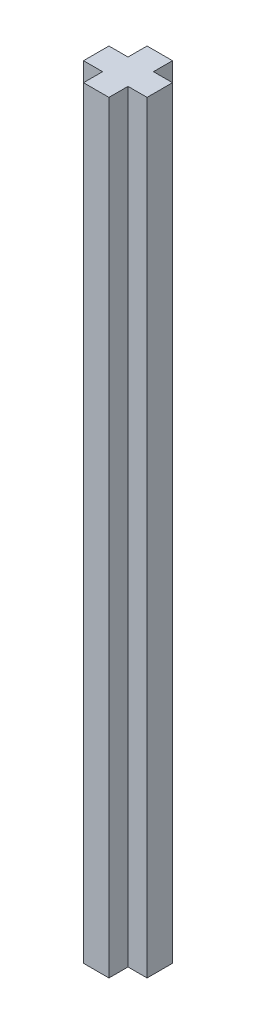
ISO-10303-21;
HEADER;
FILE_DESCRIPTION(('STEP AP214'),'2;1');
FILE_NAME('part.step','',(''),(''),'','','');
FILE_SCHEMA(('AUTOMOTIVE_DESIGN { 1 0 10303 214 1 1 1 1 }'));
ENDSEC;
DATA;
#1=APPLICATION_CONTEXT('core data for automotive mechanical design processes');
#2=APPLICATION_PROTOCOL_DEFINITION('international standard','automotive_design',2000,#1);
#3=PRODUCT_CONTEXT('',#1,'mechanical');
#4=PRODUCT('Part','Part','',(#3));
#5=PRODUCT_RELATED_PRODUCT_CATEGORY('part','',(#4));
#6=PRODUCT_DEFINITION_FORMATION('','',#4);
#7=PRODUCT_DEFINITION_CONTEXT('part definition',#1,'design');
#8=PRODUCT_DEFINITION('design','',#6,#7);
#9=PRODUCT_DEFINITION_SHAPE('','',#8);
#10=(LENGTH_UNIT() NAMED_UNIT(*) SI_UNIT(.MILLI.,.METRE.));
#11=(NAMED_UNIT(*) PLANE_ANGLE_UNIT() SI_UNIT($,.RADIAN.));
#12=(NAMED_UNIT(*) SI_UNIT($,.STERADIAN.) SOLID_ANGLE_UNIT());
#13=UNCERTAINTY_MEASURE_WITH_UNIT(LENGTH_MEASURE(1.E-05),#10,'distance_accuracy_value','');
#14=(GEOMETRIC_REPRESENTATION_CONTEXT(3) GLOBAL_UNCERTAINTY_ASSIGNED_CONTEXT((#13)) GLOBAL_UNIT_ASSIGNED_CONTEXT((#10,
#11,#12)) REPRESENTATION_CONTEXT('',''));
#15=CARTESIAN_POINT('',(0.,0.,0.));
#16=DIRECTION('',(0.,0.,1.));
#17=DIRECTION('',(1.,0.,0.));
#18=AXIS2_PLACEMENT_3D('',#15,#16,#17);
#19=CARTESIAN_POINT('',(1.,60.,0.999999999999999));
#20=DIRECTION('',(-1.,0.,0.));
#21=DIRECTION('',(0.,0.,1.));
#22=AXIS2_PLACEMENT_3D('',#19,#20,#21);
#23=PLANE('',#22);
#24=DIRECTION('',(0.,0.,-1.));
#25=VECTOR('',#24,1.);
#26=CARTESIAN_POINT('',(1.,0.,0.999999999999999));
#27=LINE('',#26,#25);
#28=CARTESIAN_POINT('',(1.,0.,2.5));
#29=VERTEX_POINT('',#28);
#30=CARTESIAN_POINT('',(1.,0.,0.999999999999999));
#31=VERTEX_POINT('',#30);
#32=EDGE_CURVE('E164',#29,#31,#27,.T.);
#33=ORIENTED_EDGE('',*,*,#32,.T.);
#34=DIRECTION('',(0.,-1.,0.));
#35=VECTOR('',#34,1.);
#36=CARTESIAN_POINT('',(1.,60.,0.999999999999999));
#37=LINE('',#36,#35);
#38=CARTESIAN_POINT('',(1.,60.,0.999999999999999));
#39=VERTEX_POINT('',#38);
#40=EDGE_CURVE('E11',#39,#31,#37,.T.);
#41=ORIENTED_EDGE('',*,*,#40,.F.);
#42=DIRECTION('',(0.,0.,-1.));
#43=VECTOR('',#42,1.);
#44=CARTESIAN_POINT('',(1.,60.,0.999999999999999));
#45=LINE('',#44,#43);
#46=CARTESIAN_POINT('',(1.,60.,2.5));
#47=VERTEX_POINT('',#46);
#48=EDGE_CURVE('E198',#47,#39,#45,.T.);
#49=ORIENTED_EDGE('',*,*,#48,.F.);
#50=DIRECTION('',(0.,-1.,0.));
#51=VECTOR('',#50,1.);
#52=CARTESIAN_POINT('',(1.,60.,2.5));
#53=LINE('',#52,#51);
#54=EDGE_CURVE('E160',#47,#29,#53,.T.);
#55=ORIENTED_EDGE('',*,*,#54,.T.);
#56=EDGE_LOOP('',(#33,#41,#49,#55));
#57=FACE_BOUND('',#56,.T.);
#58=ADVANCED_FACE('F39',(#57),#23,.F.);
#59=CARTESIAN_POINT('',(1.,60.,0.999999999999999));
#60=DIRECTION('',(0.,0.,-1.));
#61=DIRECTION('',(-1.,0.,0.));
#62=AXIS2_PLACEMENT_3D('',#59,#60,#61);
#63=PLANE('',#62);
#64=DIRECTION('',(1.,0.,0.));
#65=VECTOR('',#64,1.);
#66=CARTESIAN_POINT('',(1.,0.,0.999999999999999));
#67=LINE('',#66,#65);
#68=CARTESIAN_POINT('',(2.5,0.,0.999999999999999));
#69=VERTEX_POINT('',#68);
#70=EDGE_CURVE('E168',#31,#69,#67,.T.);
#71=ORIENTED_EDGE('',*,*,#70,.T.);
#72=DIRECTION('',(0.,-1.,0.));
#73=VECTOR('',#72,1.);
#74=CARTESIAN_POINT('',(2.5,60.,0.999999999999999));
#75=LINE('',#74,#73);
#76=CARTESIAN_POINT('',(2.5,60.,0.999999999999999));
#77=VERTEX_POINT('',#76);
#78=EDGE_CURVE('E48',#77,#69,#75,.T.);
#79=ORIENTED_EDGE('',*,*,#78,.F.);
#80=DIRECTION('',(1.,0.,0.));
#81=VECTOR('',#80,1.);
#82=CARTESIAN_POINT('',(1.,60.,0.999999999999999));
#83=LINE('',#82,#81);
#84=EDGE_CURVE('E111',#39,#77,#83,.T.);
#85=ORIENTED_EDGE('',*,*,#84,.F.);
#86=ORIENTED_EDGE('',*,*,#40,.T.);
#87=EDGE_LOOP('',(#71,#79,#85,#86));
#88=FACE_BOUND('',#87,.T.);
#89=ADVANCED_FACE('F292',(#88),#63,.F.);
#90=CARTESIAN_POINT('',(2.5,60.,-1.));
#91=DIRECTION('',(-1.,0.,0.));
#92=DIRECTION('',(0.,0.,1.));
#93=AXIS2_PLACEMENT_3D('',#90,#91,#92);
#94=PLANE('',#93);
#95=DIRECTION('',(0.,0.,-1.));
#96=VECTOR('',#95,1.);
#97=CARTESIAN_POINT('',(2.5,0.,-1.));
#98=LINE('',#97,#96);
#99=CARTESIAN_POINT('',(2.5,0.,-1.));
#100=VERTEX_POINT('',#99);
#101=EDGE_CURVE('E171',#69,#100,#98,.T.);
#102=ORIENTED_EDGE('',*,*,#101,.T.);
#103=DIRECTION('',(0.,-1.,0.));
#104=VECTOR('',#103,1.);
#105=CARTESIAN_POINT('',(2.5,60.,-1.));
#106=LINE('',#105,#104);
#107=CARTESIAN_POINT('',(2.5,60.,-1.));
#108=VERTEX_POINT('',#107);
#109=EDGE_CURVE('E225',#108,#100,#106,.T.);
#110=ORIENTED_EDGE('',*,*,#109,.F.);
#111=DIRECTION('',(0.,0.,-1.));
#112=VECTOR('',#111,1.);
#113=CARTESIAN_POINT('',(2.5,60.,-1.));
#114=LINE('',#113,#112);
#115=EDGE_CURVE('E235',#77,#108,#114,.T.);
#116=ORIENTED_EDGE('',*,*,#115,.F.);
#117=ORIENTED_EDGE('',*,*,#78,.T.);
#118=EDGE_LOOP('',(#102,#110,#116,#117));
#119=FACE_BOUND('',#118,.T.);
#120=ADVANCED_FACE('F233',(#119),#94,.F.);
#121=CARTESIAN_POINT('',(1.,60.,-1.));
#122=DIRECTION('',(0.,0.,1.));
#123=DIRECTION('',(1.,0.,0.));
#124=AXIS2_PLACEMENT_3D('',#121,#122,#123);
#125=PLANE('',#124);
#126=DIRECTION('',(-1.,0.,0.));
#127=VECTOR('',#126,1.);
#128=CARTESIAN_POINT('',(1.,0.,-1.));
#129=LINE('',#128,#127);
#130=CARTESIAN_POINT('',(1.,0.,-1.));
#131=VERTEX_POINT('',#130);
#132=EDGE_CURVE('E174',#100,#131,#129,.T.);
#133=ORIENTED_EDGE('',*,*,#132,.T.);
#134=DIRECTION('',(0.,-1.,0.));
#135=VECTOR('',#134,1.);
#136=CARTESIAN_POINT('',(1.,60.,-1.));
#137=LINE('',#136,#135);
#138=CARTESIAN_POINT('',(1.,60.,-1.));
#139=VERTEX_POINT('',#138);
#140=EDGE_CURVE('E221',#139,#131,#137,.T.);
#141=ORIENTED_EDGE('',*,*,#140,.F.);
#142=DIRECTION('',(-1.,0.,0.));
#143=VECTOR('',#142,1.);
#144=CARTESIAN_POINT('',(1.,60.,-1.));
#145=LINE('',#144,#143);
#146=EDGE_CURVE('E254',#108,#139,#145,.T.);
#147=ORIENTED_EDGE('',*,*,#146,.F.);
#148=ORIENTED_EDGE('',*,*,#109,.T.);
#149=EDGE_LOOP('',(#133,#141,#147,#148));
#150=FACE_BOUND('',#149,.T.);
#151=ADVANCED_FACE('F244',(#150),#125,.F.);
#152=CARTESIAN_POINT('',(1.,60.,-2.5));
#153=DIRECTION('',(-1.,0.,0.));
#154=DIRECTION('',(0.,0.,1.));
#155=AXIS2_PLACEMENT_3D('',#152,#153,#154);
#156=PLANE('',#155);
#157=DIRECTION('',(0.,0.,-1.));
#158=VECTOR('',#157,1.);
#159=CARTESIAN_POINT('',(1.,0.,-2.5));
#160=LINE('',#159,#158);
#161=CARTESIAN_POINT('',(1.,0.,-2.5));
#162=VERTEX_POINT('',#161);
#163=EDGE_CURVE('E177',#131,#162,#160,.T.);
#164=ORIENTED_EDGE('',*,*,#163,.T.);
#165=DIRECTION('',(0.,-1.,0.));
#166=VECTOR('',#165,1.);
#167=CARTESIAN_POINT('',(1.,60.,-2.5));
#168=LINE('',#167,#166);
#169=CARTESIAN_POINT('',(1.,60.,-2.5));
#170=VERTEX_POINT('',#169);
#171=EDGE_CURVE('E217',#170,#162,#168,.T.);
#172=ORIENTED_EDGE('',*,*,#171,.F.);
#173=DIRECTION('',(0.,0.,-1.));
#174=VECTOR('',#173,1.);
#175=CARTESIAN_POINT('',(1.,60.,-2.5));
#176=LINE('',#175,#174);
#177=EDGE_CURVE('E250',#139,#170,#176,.T.);
#178=ORIENTED_EDGE('',*,*,#177,.F.);
#179=ORIENTED_EDGE('',*,*,#140,.T.);
#180=EDGE_LOOP('',(#164,#172,#178,#179));
#181=FACE_BOUND('',#180,.T.);
#182=ADVANCED_FACE('F248',(#181),#156,.F.);
#183=CARTESIAN_POINT('',(-1.,60.,-2.5));
#184=DIRECTION('',(0.,0.,1.));
#185=DIRECTION('',(1.,0.,0.));
#186=AXIS2_PLACEMENT_3D('',#183,#184,#185);
#187=PLANE('',#186);
#188=DIRECTION('',(-1.,0.,0.));
#189=VECTOR('',#188,1.);
#190=CARTESIAN_POINT('',(-1.,0.,-2.5));
#191=LINE('',#190,#189);
#192=CARTESIAN_POINT('',(-1.,0.,-2.5));
#193=VERTEX_POINT('',#192);
#194=EDGE_CURVE('E180',#162,#193,#191,.T.);
#195=ORIENTED_EDGE('',*,*,#194,.T.);
#196=DIRECTION('',(0.,-1.,0.));
#197=VECTOR('',#196,1.);
#198=CARTESIAN_POINT('',(-1.,60.,-2.5));
#199=LINE('',#198,#197);
#200=CARTESIAN_POINT('',(-1.,60.,-2.5));
#201=VERTEX_POINT('',#200);
#202=EDGE_CURVE('E213',#201,#193,#199,.T.);
#203=ORIENTED_EDGE('',*,*,#202,.F.);
#204=DIRECTION('',(-1.,0.,0.));
#205=VECTOR('',#204,1.);
#206=CARTESIAN_POINT('',(-1.,60.,-2.5));
#207=LINE('',#206,#205);
#208=EDGE_CURVE('E253',#170,#201,#207,.T.);
#209=ORIENTED_EDGE('',*,*,#208,.F.);
#210=ORIENTED_EDGE('',*,*,#171,.T.);
#211=EDGE_LOOP('',(#195,#203,#209,#210));
#212=FACE_BOUND('',#211,.T.);
#213=ADVANCED_FACE('F305',(#212),#187,.F.);
#214=CARTESIAN_POINT('',(-1.,60.,-2.5));
#215=DIRECTION('',(1.,0.,0.));
#216=DIRECTION('',(0.,0.,-1.));
#217=AXIS2_PLACEMENT_3D('',#214,#215,#216);
#218=PLANE('',#217);
#219=DIRECTION('',(0.,0.,1.));
#220=VECTOR('',#219,1.);
#221=CARTESIAN_POINT('',(-1.,0.,-2.5));
#222=LINE('',#221,#220);
#223=CARTESIAN_POINT('',(-1.,0.,-1.));
#224=VERTEX_POINT('',#223);
#225=EDGE_CURVE('E183',#193,#224,#222,.T.);
#226=ORIENTED_EDGE('',*,*,#225,.T.);
#227=DIRECTION('',(0.,-1.,0.));
#228=VECTOR('',#227,1.);
#229=CARTESIAN_POINT('',(-1.,60.,-1.));
#230=LINE('',#229,#228);
#231=CARTESIAN_POINT('',(-1.,60.,-1.));
#232=VERTEX_POINT('',#231);
#233=EDGE_CURVE('E209',#232,#224,#230,.T.);
#234=ORIENTED_EDGE('',*,*,#233,.F.);
#235=DIRECTION('',(0.,0.,1.));
#236=VECTOR('',#235,1.);
#237=CARTESIAN_POINT('',(-1.,60.,-2.5));
#238=LINE('',#237,#236);
#239=EDGE_CURVE('E258',#201,#232,#238,.T.);
#240=ORIENTED_EDGE('',*,*,#239,.F.);
#241=ORIENTED_EDGE('',*,*,#202,.T.);
#242=EDGE_LOOP('',(#226,#234,#240,#241));
#243=FACE_BOUND('',#242,.T.);
#244=ADVANCED_FACE('F308',(#243),#218,.F.);
#245=CARTESIAN_POINT('',(-2.5,60.,-1.));
#246=DIRECTION('',(0.,0.,1.));
#247=DIRECTION('',(1.,0.,0.));
#248=AXIS2_PLACEMENT_3D('',#245,#246,#247);
#249=PLANE('',#248);
#250=DIRECTION('',(-1.,0.,0.));
#251=VECTOR('',#250,1.);
#252=CARTESIAN_POINT('',(-2.5,0.,-1.));
#253=LINE('',#252,#251);
#254=CARTESIAN_POINT('',(-2.5,0.,-1.));
#255=VERTEX_POINT('',#254);
#256=EDGE_CURVE('E186',#224,#255,#253,.T.);
#257=ORIENTED_EDGE('',*,*,#256,.T.);
#258=DIRECTION('',(0.,-1.,0.));
#259=VECTOR('',#258,1.);
#260=CARTESIAN_POINT('',(-2.5,60.,-1.));
#261=LINE('',#260,#259);
#262=CARTESIAN_POINT('',(-2.5,60.,-1.));
#263=VERTEX_POINT('',#262);
#264=EDGE_CURVE('E205',#263,#255,#261,.T.);
#265=ORIENTED_EDGE('',*,*,#264,.F.);
#266=DIRECTION('',(-1.,0.,0.));
#267=VECTOR('',#266,1.);
#268=CARTESIAN_POINT('',(-2.5,60.,-1.));
#269=LINE('',#268,#267);
#270=EDGE_CURVE('E265',#232,#263,#269,.T.);
#271=ORIENTED_EDGE('',*,*,#270,.F.);
#272=ORIENTED_EDGE('',*,*,#233,.T.);
#273=EDGE_LOOP('',(#257,#265,#271,#272));
#274=FACE_BOUND('',#273,.T.);
#275=ADVANCED_FACE('F273',(#274),#249,.F.);
#276=CARTESIAN_POINT('',(-2.5,60.,-1.));
#277=DIRECTION('',(1.,0.,0.));
#278=DIRECTION('',(0.,0.,-1.));
#279=AXIS2_PLACEMENT_3D('',#276,#277,#278);
#280=PLANE('',#279);
#281=DIRECTION('',(0.,0.,1.));
#282=VECTOR('',#281,1.);
#283=CARTESIAN_POINT('',(-2.5,0.,-1.));
#284=LINE('',#283,#282);
#285=CARTESIAN_POINT('',(-2.5,0.,0.999999999999999));
#286=VERTEX_POINT('',#285);
#287=EDGE_CURVE('E189',#255,#286,#284,.T.);
#288=ORIENTED_EDGE('',*,*,#287,.T.);
#289=DIRECTION('',(0.,-1.,0.));
#290=VECTOR('',#289,1.);
#291=CARTESIAN_POINT('',(-2.5,60.,0.999999999999999));
#292=LINE('',#291,#290);
#293=CARTESIAN_POINT('',(-2.5,60.,0.999999999999999));
#294=VERTEX_POINT('',#293);
#295=EDGE_CURVE('E153',#294,#286,#292,.T.);
#296=ORIENTED_EDGE('',*,*,#295,.F.);
#297=DIRECTION('',(0.,0.,1.));
#298=VECTOR('',#297,1.);
#299=CARTESIAN_POINT('',(-2.5,60.,-1.));
#300=LINE('',#299,#298);
#301=EDGE_CURVE('E142',#263,#294,#300,.T.);
#302=ORIENTED_EDGE('',*,*,#301,.F.);
#303=ORIENTED_EDGE('',*,*,#264,.T.);
#304=EDGE_LOOP('',(#288,#296,#302,#303));
#305=FACE_BOUND('',#304,.T.);
#306=ADVANCED_FACE('F277',(#305),#280,.F.);
#307=CARTESIAN_POINT('',(-2.5,60.,0.999999999999999));
#308=DIRECTION('',(0.,0.,-1.));
#309=DIRECTION('',(-1.,0.,0.));
#310=AXIS2_PLACEMENT_3D('',#307,#308,#309);
#311=PLANE('',#310);
#312=DIRECTION('',(1.,0.,0.));
#313=VECTOR('',#312,1.);
#314=CARTESIAN_POINT('',(-2.5,0.,0.999999999999999));
#315=LINE('',#314,#313);
#316=CARTESIAN_POINT('',(-1.,0.,0.999999999999999));
#317=VERTEX_POINT('',#316);
#318=EDGE_CURVE('E151',#286,#317,#315,.T.);
#319=ORIENTED_EDGE('',*,*,#318,.T.);
#320=DIRECTION('',(0.,-1.,0.));
#321=VECTOR('',#320,1.);
#322=CARTESIAN_POINT('',(-1.,60.,0.999999999999999));
#323=LINE('',#322,#321);
#324=CARTESIAN_POINT('',(-1.,60.,0.999999999999999));
#325=VERTEX_POINT('',#324);
#326=EDGE_CURVE('E148',#325,#317,#323,.T.);
#327=ORIENTED_EDGE('',*,*,#326,.F.);
#328=DIRECTION('',(1.,0.,0.));
#329=VECTOR('',#328,1.);
#330=CARTESIAN_POINT('',(-2.5,60.,0.999999999999999));
#331=LINE('',#330,#329);
#332=EDGE_CURVE('E136',#294,#325,#331,.T.);
#333=ORIENTED_EDGE('',*,*,#332,.F.);
#334=ORIENTED_EDGE('',*,*,#295,.T.);
#335=EDGE_LOOP('',(#319,#327,#333,#334));
#336=FACE_BOUND('',#335,.T.);
#337=ADVANCED_FACE('F149',(#336),#311,.F.);
#338=CARTESIAN_POINT('',(-1.,60.,0.999999999999999));
#339=DIRECTION('',(1.,0.,0.));
#340=DIRECTION('',(0.,0.,-1.));
#341=AXIS2_PLACEMENT_3D('',#338,#339,#340);
#342=PLANE('',#341);
#343=DIRECTION('',(0.,0.,1.));
#344=VECTOR('',#343,1.);
#345=CARTESIAN_POINT('',(-1.,0.,0.999999999999999));
#346=LINE('',#345,#344);
#347=CARTESIAN_POINT('',(-1.,0.,2.5));
#348=VERTEX_POINT('',#347);
#349=EDGE_CURVE('E97',#317,#348,#346,.T.);
#350=ORIENTED_EDGE('',*,*,#349,.T.);
#351=DIRECTION('',(0.,-1.,0.));
#352=VECTOR('',#351,1.);
#353=CARTESIAN_POINT('',(-1.,60.,2.5));
#354=LINE('',#353,#352);
#355=CARTESIAN_POINT('',(-1.,60.,2.5));
#356=VERTEX_POINT('',#355);
#357=EDGE_CURVE('E154',#356,#348,#354,.T.);
#358=ORIENTED_EDGE('',*,*,#357,.F.);
#359=DIRECTION('',(0.,0.,1.));
#360=VECTOR('',#359,1.);
#361=CARTESIAN_POINT('',(-1.,60.,0.999999999999999));
#362=LINE('',#361,#360);
#363=EDGE_CURVE('E140',#325,#356,#362,.T.);
#364=ORIENTED_EDGE('',*,*,#363,.F.);
#365=ORIENTED_EDGE('',*,*,#326,.T.);
#366=EDGE_LOOP('',(#350,#358,#364,#365));
#367=FACE_BOUND('',#366,.T.);
#368=ADVANCED_FACE('F156',(#367),#342,.F.);
#369=CARTESIAN_POINT('',(-1.,60.,2.5));
#370=DIRECTION('',(0.,0.,-1.));
#371=DIRECTION('',(-1.,0.,0.));
#372=AXIS2_PLACEMENT_3D('',#369,#370,#371);
#373=PLANE('',#372);
#374=DIRECTION('',(1.,0.,0.));
#375=VECTOR('',#374,1.);
#376=CARTESIAN_POINT('',(-1.,0.,2.5));
#377=LINE('',#376,#375);
#378=EDGE_CURVE('E103',#348,#29,#377,.T.);
#379=ORIENTED_EDGE('',*,*,#378,.T.);
#380=ORIENTED_EDGE('',*,*,#54,.F.);
#381=DIRECTION('',(1.,0.,0.));
#382=VECTOR('',#381,1.);
#383=CARTESIAN_POINT('',(-1.,60.,2.5));
#384=LINE('',#383,#382);
#385=EDGE_CURVE('E56',#356,#47,#384,.T.);
#386=ORIENTED_EDGE('',*,*,#385,.F.);
#387=ORIENTED_EDGE('',*,*,#357,.T.);
#388=EDGE_LOOP('',(#379,#380,#386,#387));
#389=FACE_BOUND('',#388,.T.);
#390=ADVANCED_FACE('F281',(#389),#373,.F.);
#391=CARTESIAN_POINT('',(0.,60.,0.));
#392=DIRECTION('',(0.,1.,0.));
#393=DIRECTION('',(0.,0.,1.));
#394=AXIS2_PLACEMENT_3D('',#391,#392,#393);
#395=PLANE('',#394);
#396=ORIENTED_EDGE('',*,*,#48,.T.);
#397=ORIENTED_EDGE('',*,*,#84,.T.);
#398=ORIENTED_EDGE('',*,*,#115,.T.);
#399=ORIENTED_EDGE('',*,*,#146,.T.);
#400=ORIENTED_EDGE('',*,*,#177,.T.);
#401=ORIENTED_EDGE('',*,*,#208,.T.);
#402=ORIENTED_EDGE('',*,*,#239,.T.);
#403=ORIENTED_EDGE('',*,*,#270,.T.);
#404=ORIENTED_EDGE('',*,*,#301,.T.);
#405=ORIENTED_EDGE('',*,*,#332,.T.);
#406=ORIENTED_EDGE('',*,*,#363,.T.);
#407=ORIENTED_EDGE('',*,*,#385,.T.);
#408=EDGE_LOOP('',(#396,#397,#398,#399,#400,#401,#402,#403,#404,#405,#406,#407));
#409=FACE_BOUND('',#408,.T.);
#410=ADVANCED_FACE('F138',(#409),#395,.T.);
#411=CARTESIAN_POINT('',(0.,0.,0.));
#412=DIRECTION('',(0.,1.,0.));
#413=DIRECTION('',(0.,0.,1.));
#414=AXIS2_PLACEMENT_3D('',#411,#412,#413);
#415=PLANE('',#414);
#416=ORIENTED_EDGE('',*,*,#32,.F.);
#417=ORIENTED_EDGE('',*,*,#378,.F.);
#418=ORIENTED_EDGE('',*,*,#349,.F.);
#419=ORIENTED_EDGE('',*,*,#318,.F.);
#420=ORIENTED_EDGE('',*,*,#287,.F.);
#421=ORIENTED_EDGE('',*,*,#256,.F.);
#422=ORIENTED_EDGE('',*,*,#225,.F.);
#423=ORIENTED_EDGE('',*,*,#194,.F.);
#424=ORIENTED_EDGE('',*,*,#163,.F.);
#425=ORIENTED_EDGE('',*,*,#132,.F.);
#426=ORIENTED_EDGE('',*,*,#101,.F.);
#427=ORIENTED_EDGE('',*,*,#70,.F.);
#428=EDGE_LOOP('',(#416,#417,#418,#419,#420,#421,#422,#423,#424,#425,#426,#427));
#429=FACE_BOUND('',#428,.T.);
#430=ADVANCED_FACE('F239',(#429),#415,.F.);
#431=CLOSED_SHELL('',(#58,#89,#120,#151,#182,#213,#244,#275,#306,#337,#368,#390,#410,#430));
#432=MANIFOLD_SOLID_BREP('B2',#431);
#433=ADVANCED_BREP_SHAPE_REPRESENTATION('',(#18,#432),#14);
#434=SHAPE_DEFINITION_REPRESENTATION(#9,#433);
ENDSEC;
END-ISO-10303-21;
